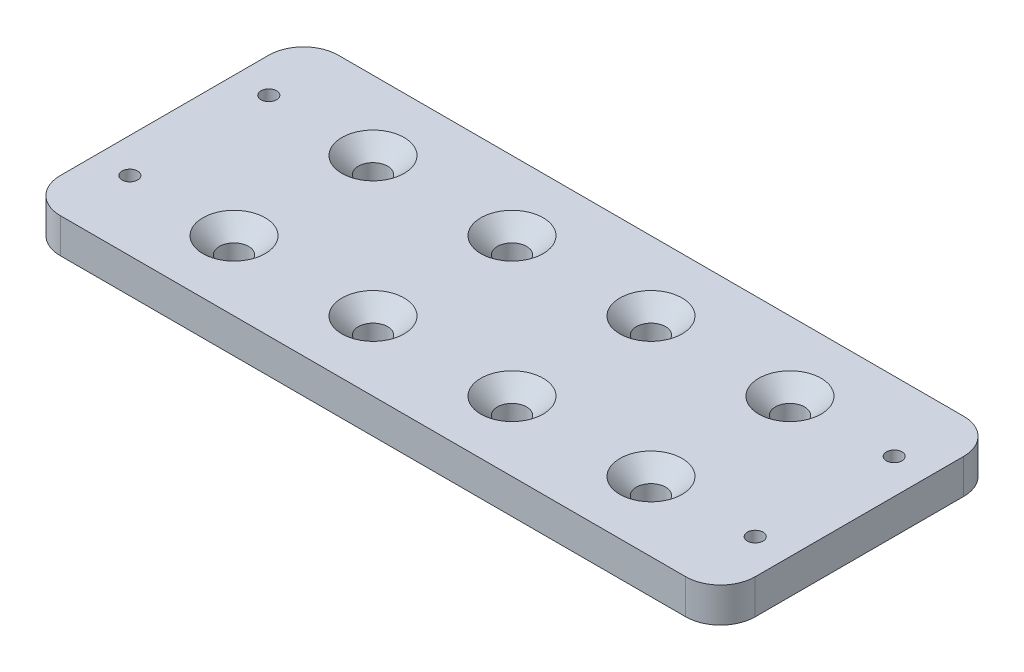
ISO-10303-21;
HEADER;
FILE_DESCRIPTION(('STEP AP214'),'2;1');
FILE_NAME('part.step','',(''),(''),'','','');
FILE_SCHEMA(('AUTOMOTIVE_DESIGN { 1 0 10303 214 1 1 1 1 }'));
ENDSEC;
DATA;
#1=APPLICATION_CONTEXT('core data for automotive mechanical design processes');
#2=APPLICATION_PROTOCOL_DEFINITION('international standard','automotive_design',2000,#1);
#3=PRODUCT_CONTEXT('',#1,'mechanical');
#4=PRODUCT('Part','Part','',(#3));
#5=PRODUCT_RELATED_PRODUCT_CATEGORY('part','',(#4));
#6=PRODUCT_DEFINITION_FORMATION('','',#4);
#7=PRODUCT_DEFINITION_CONTEXT('part definition',#1,'design');
#8=PRODUCT_DEFINITION('design','',#6,#7);
#9=PRODUCT_DEFINITION_SHAPE('','',#8);
#10=(LENGTH_UNIT() NAMED_UNIT(*) SI_UNIT(.MILLI.,.METRE.));
#11=(NAMED_UNIT(*) PLANE_ANGLE_UNIT() SI_UNIT($,.RADIAN.));
#12=(NAMED_UNIT(*) SI_UNIT($,.STERADIAN.) SOLID_ANGLE_UNIT());
#13=UNCERTAINTY_MEASURE_WITH_UNIT(LENGTH_MEASURE(1.E-05),#10,'distance_accuracy_value','');
#14=(GEOMETRIC_REPRESENTATION_CONTEXT(3) GLOBAL_UNCERTAINTY_ASSIGNED_CONTEXT((#13)) GLOBAL_UNIT_ASSIGNED_CONTEXT((#10,
#11,#12)) REPRESENTATION_CONTEXT('',''));
#15=CARTESIAN_POINT('',(0.,0.,0.));
#16=DIRECTION('',(0.,0.,1.));
#17=DIRECTION('',(1.,0.,0.));
#18=AXIS2_PLACEMENT_3D('',#15,#16,#17);
#19=CARTESIAN_POINT('',(100.,10.,40.));
#20=DIRECTION('',(-1.,0.,0.));
#21=DIRECTION('',(0.,0.,1.));
#22=AXIS2_PLACEMENT_3D('',#19,#20,#21);
#23=PLANE('',#22);
#24=DIRECTION('',(0.,0.,-1.));
#25=VECTOR('',#24,1.);
#26=CARTESIAN_POINT('',(100.,0.,40.));
#27=LINE('',#26,#25);
#28=CARTESIAN_POINT('',(100.,0.,30.));
#29=VERTEX_POINT('',#28);
#30=CARTESIAN_POINT('',(100.,0.,-30.));
#31=VERTEX_POINT('',#30);
#32=EDGE_CURVE('E132',#29,#31,#27,.T.);
#33=ORIENTED_EDGE('',*,*,#32,.T.);
#34=DIRECTION('',(0.,-1.,0.));
#35=VECTOR('',#34,1.);
#36=CARTESIAN_POINT('',(100.,10.,-30.));
#37=LINE('',#36,#35);
#38=CARTESIAN_POINT('',(100.,10.,-30.));
#39=VERTEX_POINT('',#38);
#40=EDGE_CURVE('E11',#31,#39,#37,.F.);
#41=ORIENTED_EDGE('',*,*,#40,.T.);
#42=DIRECTION('',(0.,0.,-1.));
#43=VECTOR('',#42,1.);
#44=CARTESIAN_POINT('',(100.,10.,40.));
#45=LINE('',#44,#43);
#46=CARTESIAN_POINT('',(100.,10.,30.));
#47=VERTEX_POINT('',#46);
#48=EDGE_CURVE('E135',#47,#39,#45,.T.);
#49=ORIENTED_EDGE('',*,*,#48,.F.);
#50=DIRECTION('',(0.,-1.,0.));
#51=VECTOR('',#50,1.);
#52=CARTESIAN_POINT('',(100.,10.,30.));
#53=LINE('',#52,#51);
#54=EDGE_CURVE('E50',#47,#29,#53,.T.);
#55=ORIENTED_EDGE('',*,*,#54,.T.);
#56=EDGE_LOOP('',(#33,#41,#49,#55));
#57=FACE_BOUND('',#56,.T.);
#58=ADVANCED_FACE('F39',(#57),#23,.F.);
#59=CARTESIAN_POINT('',(-100.,10.,-40.));
#60=DIRECTION('',(0.,0.,1.));
#61=DIRECTION('',(1.,0.,0.));
#62=AXIS2_PLACEMENT_3D('',#59,#60,#61);
#63=PLANE('',#62);
#64=DIRECTION('',(-1.,0.,0.));
#65=VECTOR('',#64,1.);
#66=CARTESIAN_POINT('',(-100.,0.,-40.));
#67=LINE('',#66,#65);
#68=CARTESIAN_POINT('',(90.,0.,-40.));
#69=VERTEX_POINT('',#68);
#70=CARTESIAN_POINT('',(-90.,0.,-40.));
#71=VERTEX_POINT('',#70);
#72=EDGE_CURVE('E134',#69,#71,#67,.T.);
#73=ORIENTED_EDGE('',*,*,#72,.T.);
#74=DIRECTION('',(0.,-1.,0.));
#75=VECTOR('',#74,1.);
#76=CARTESIAN_POINT('',(-90.,10.,-40.));
#77=LINE('',#76,#75);
#78=CARTESIAN_POINT('',(-90.,10.,-40.));
#79=VERTEX_POINT('',#78);
#80=EDGE_CURVE('E109',#71,#79,#77,.F.);
#81=ORIENTED_EDGE('',*,*,#80,.T.);
#82=DIRECTION('',(-1.,0.,0.));
#83=VECTOR('',#82,1.);
#84=CARTESIAN_POINT('',(-100.,10.,-40.));
#85=LINE('',#84,#83);
#86=CARTESIAN_POINT('',(90.,10.,-40.));
#87=VERTEX_POINT('',#86);
#88=EDGE_CURVE('E172',#87,#79,#85,.T.);
#89=ORIENTED_EDGE('',*,*,#88,.F.);
#90=DIRECTION('',(0.,-1.,0.));
#91=VECTOR('',#90,1.);
#92=CARTESIAN_POINT('',(90.,10.,-40.));
#93=LINE('',#92,#91);
#94=EDGE_CURVE('E113',#87,#69,#93,.T.);
#95=ORIENTED_EDGE('',*,*,#94,.T.);
#96=EDGE_LOOP('',(#73,#81,#89,#95));
#97=FACE_BOUND('',#96,.T.);
#98=ADVANCED_FACE('F305',(#97),#63,.F.);
#99=CARTESIAN_POINT('',(-100.,10.,40.));
#100=DIRECTION('',(1.,0.,0.));
#101=DIRECTION('',(0.,0.,-1.));
#102=AXIS2_PLACEMENT_3D('',#99,#100,#101);
#103=PLANE('',#102);
#104=DIRECTION('',(0.,0.,1.));
#105=VECTOR('',#104,1.);
#106=CARTESIAN_POINT('',(-100.,10.,40.));
#107=LINE('',#106,#105);
#108=CARTESIAN_POINT('',(-100.,10.,-30.));
#109=VERTEX_POINT('',#108);
#110=CARTESIAN_POINT('',(-100.,10.,30.));
#111=VERTEX_POINT('',#110);
#112=EDGE_CURVE('E125',#109,#111,#107,.T.);
#113=ORIENTED_EDGE('',*,*,#112,.F.);
#114=DIRECTION('',(0.,-1.,0.));
#115=VECTOR('',#114,1.);
#116=CARTESIAN_POINT('',(-100.,10.,-30.));
#117=LINE('',#116,#115);
#118=CARTESIAN_POINT('',(-100.,0.,-30.));
#119=VERTEX_POINT('',#118);
#120=EDGE_CURVE('E108',#109,#119,#117,.T.);
#121=ORIENTED_EDGE('',*,*,#120,.T.);
#122=DIRECTION('',(0.,0.,1.));
#123=VECTOR('',#122,1.);
#124=CARTESIAN_POINT('',(-100.,0.,40.));
#125=LINE('',#124,#123);
#126=CARTESIAN_POINT('',(-100.,0.,30.));
#127=VERTEX_POINT('',#126);
#128=EDGE_CURVE('E124',#119,#127,#125,.T.);
#129=ORIENTED_EDGE('',*,*,#128,.T.);
#130=DIRECTION('',(0.,-1.,0.));
#131=VECTOR('',#130,1.);
#132=CARTESIAN_POINT('',(-100.,10.,30.));
#133=LINE('',#132,#131);
#134=EDGE_CURVE('E127',#127,#111,#133,.F.);
#135=ORIENTED_EDGE('',*,*,#134,.T.);
#136=EDGE_LOOP('',(#113,#121,#129,#135));
#137=FACE_BOUND('',#136,.T.);
#138=ADVANCED_FACE('F123',(#137),#103,.F.);
#139=CARTESIAN_POINT('',(-100.,10.,40.));
#140=DIRECTION('',(0.,0.,-1.));
#141=DIRECTION('',(-1.,0.,0.));
#142=AXIS2_PLACEMENT_3D('',#139,#140,#141);
#143=PLANE('',#142);
#144=DIRECTION('',(1.,0.,0.));
#145=VECTOR('',#144,1.);
#146=CARTESIAN_POINT('',(-100.,10.,40.));
#147=LINE('',#146,#145);
#148=CARTESIAN_POINT('',(-90.,10.,40.));
#149=VERTEX_POINT('',#148);
#150=CARTESIAN_POINT('',(90.,10.,40.));
#151=VERTEX_POINT('',#150);
#152=EDGE_CURVE('E140',#149,#151,#147,.T.);
#153=ORIENTED_EDGE('',*,*,#152,.F.);
#154=DIRECTION('',(0.,-1.,0.));
#155=VECTOR('',#154,1.);
#156=CARTESIAN_POINT('',(-90.,10.,40.));
#157=LINE('',#156,#155);
#158=CARTESIAN_POINT('',(-90.,0.,40.));
#159=VERTEX_POINT('',#158);
#160=EDGE_CURVE('E156',#149,#159,#157,.T.);
#161=ORIENTED_EDGE('',*,*,#160,.T.);
#162=DIRECTION('',(1.,0.,0.));
#163=VECTOR('',#162,1.);
#164=CARTESIAN_POINT('',(-100.,0.,40.));
#165=LINE('',#164,#163);
#166=CARTESIAN_POINT('',(90.,0.,40.));
#167=VERTEX_POINT('',#166);
#168=EDGE_CURVE('E128',#159,#167,#165,.T.);
#169=ORIENTED_EDGE('',*,*,#168,.T.);
#170=DIRECTION('',(0.,-1.,0.));
#171=VECTOR('',#170,1.);
#172=CARTESIAN_POINT('',(90.,10.,40.));
#173=LINE('',#172,#171);
#174=EDGE_CURVE('E53',#167,#151,#173,.F.);
#175=ORIENTED_EDGE('',*,*,#174,.T.);
#176=EDGE_LOOP('',(#153,#161,#169,#175));
#177=FACE_BOUND('',#176,.T.);
#178=ADVANCED_FACE('F280',(#177),#143,.F.);
#179=CARTESIAN_POINT('',(0.,10.,0.));
#180=DIRECTION('',(0.,-1.,0.));
#181=DIRECTION('',(0.,0.,-1.));
#182=AXIS2_PLACEMENT_3D('',#179,#180,#181);
#183=PLANE('',#182);
#184=CARTESIAN_POINT('',(-90.,10.,-20.));
#185=DIRECTION('',(0.,1.,0.));
#186=DIRECTION('',(0.,0.,1.));
#187=AXIS2_PLACEMENT_3D('',#184,#185,#186);
#188=CIRCLE('',#187,2.25);
#189=CARTESIAN_POINT('',(-90.,10.,-17.75));
#190=VERTEX_POINT('',#189);
#191=EDGE_CURVE('E268',#190,#190,#188,.T.);
#192=ORIENTED_EDGE('',*,*,#191,.F.);
#193=EDGE_LOOP('',(#192));
#194=FACE_BOUND('',#193,.T.);
#195=CARTESIAN_POINT('',(90.,10.,-20.));
#196=DIRECTION('',(0.,1.,0.));
#197=DIRECTION('',(0.,0.,1.));
#198=AXIS2_PLACEMENT_3D('',#195,#196,#197);
#199=CIRCLE('',#198,2.25);
#200=CARTESIAN_POINT('',(90.,10.,-17.75));
#201=VERTEX_POINT('',#200);
#202=EDGE_CURVE('E265',#201,#201,#199,.T.);
#203=ORIENTED_EDGE('',*,*,#202,.F.);
#204=EDGE_LOOP('',(#203));
#205=FACE_BOUND('',#204,.T.);
#206=CARTESIAN_POINT('',(90.000000000001,10.,20.));
#207=DIRECTION('',(0.,1.,0.));
#208=DIRECTION('',(0.,0.,1.));
#209=AXIS2_PLACEMENT_3D('',#206,#207,#208);
#210=CIRCLE('',#209,2.25);
#211=CARTESIAN_POINT('',(90.000000000001,10.,22.25));
#212=VERTEX_POINT('',#211);
#213=EDGE_CURVE('E258',#212,#212,#210,.T.);
#214=ORIENTED_EDGE('',*,*,#213,.F.);
#215=EDGE_LOOP('',(#214));
#216=FACE_BOUND('',#215,.T.);
#217=CARTESIAN_POINT('',(-89.9999999999996,10.,20.));
#218=DIRECTION('',(0.,1.,0.));
#219=DIRECTION('',(0.,0.,1.));
#220=AXIS2_PLACEMENT_3D('',#217,#218,#219);
#221=CIRCLE('',#220,2.25);
#222=CARTESIAN_POINT('',(-89.9999999999996,10.,22.25));
#223=VERTEX_POINT('',#222);
#224=EDGE_CURVE('E246',#223,#223,#221,.T.);
#225=ORIENTED_EDGE('',*,*,#224,.F.);
#226=EDGE_LOOP('',(#225));
#227=FACE_BOUND('',#226,.T.);
#228=CARTESIAN_POINT('',(-20.,10.,-20.));
#229=DIRECTION('',(0.,1.,0.));
#230=DIRECTION('',(0.,0.,1.));
#231=AXIS2_PLACEMENT_3D('',#228,#229,#230);
#232=CIRCLE('',#231,8.96);
#233=CARTESIAN_POINT('',(-20.,10.,-11.04));
#234=VERTEX_POINT('',#233);
#235=EDGE_CURVE('E243',#234,#234,#232,.T.);
#236=ORIENTED_EDGE('',*,*,#235,.F.);
#237=EDGE_LOOP('',(#236));
#238=FACE_BOUND('',#237,.T.);
#239=CARTESIAN_POINT('',(19.9999999999995,10.,20.));
#240=DIRECTION('',(0.,1.,0.));
#241=DIRECTION('',(0.,0.,1.));
#242=AXIS2_PLACEMENT_3D('',#239,#240,#241);
#243=CIRCLE('',#242,8.96);
#244=CARTESIAN_POINT('',(19.9999999999995,10.,28.96));
#245=VERTEX_POINT('',#244);
#246=EDGE_CURVE('E231',#245,#245,#243,.T.);
#247=ORIENTED_EDGE('',*,*,#246,.F.);
#248=EDGE_LOOP('',(#247));
#249=FACE_BOUND('',#248,.T.);
#250=CARTESIAN_POINT('',(59.9999999999996,10.,20.));
#251=DIRECTION('',(0.,1.,0.));
#252=DIRECTION('',(0.,0.,1.));
#253=AXIS2_PLACEMENT_3D('',#250,#251,#252);
#254=CIRCLE('',#253,8.96);
#255=CARTESIAN_POINT('',(59.9999999999996,10.,28.96));
#256=VERTEX_POINT('',#255);
#257=EDGE_CURVE('E229',#256,#256,#254,.T.);
#258=ORIENTED_EDGE('',*,*,#257,.F.);
#259=EDGE_LOOP('',(#258));
#260=FACE_BOUND('',#259,.T.);
#261=CARTESIAN_POINT('',(-19.9999999999996,10.,20.));
#262=DIRECTION('',(0.,1.,0.));
#263=DIRECTION('',(0.,0.,1.));
#264=AXIS2_PLACEMENT_3D('',#261,#262,#263);
#265=CIRCLE('',#264,8.96);
#266=CARTESIAN_POINT('',(-19.9999999999996,10.,28.96));
#267=VERTEX_POINT('',#266);
#268=EDGE_CURVE('E220',#267,#267,#265,.T.);
#269=ORIENTED_EDGE('',*,*,#268,.F.);
#270=EDGE_LOOP('',(#269));
#271=FACE_BOUND('',#270,.T.);
#272=CARTESIAN_POINT('',(-59.9999999999996,10.,20.));
#273=DIRECTION('',(0.,1.,0.));
#274=DIRECTION('',(0.,0.,1.));
#275=AXIS2_PLACEMENT_3D('',#272,#273,#274);
#276=CIRCLE('',#275,8.96);
#277=CARTESIAN_POINT('',(-59.9999999999996,10.,28.96));
#278=VERTEX_POINT('',#277);
#279=EDGE_CURVE('E208',#278,#278,#276,.T.);
#280=ORIENTED_EDGE('',*,*,#279,.F.);
#281=EDGE_LOOP('',(#280));
#282=FACE_BOUND('',#281,.T.);
#283=CARTESIAN_POINT('',(59.9999999999999,10.,-20.));
#284=DIRECTION('',(0.,1.,0.));
#285=DIRECTION('',(0.,0.,1.));
#286=AXIS2_PLACEMENT_3D('',#283,#284,#285);
#287=CIRCLE('',#286,8.96);
#288=CARTESIAN_POINT('',(59.9999999999999,10.,-11.04));
#289=VERTEX_POINT('',#288);
#290=EDGE_CURVE('E200',#289,#289,#287,.T.);
#291=ORIENTED_EDGE('',*,*,#290,.F.);
#292=EDGE_LOOP('',(#291));
#293=FACE_BOUND('',#292,.T.);
#294=CARTESIAN_POINT('',(19.9999999999999,10.,-20.));
#295=DIRECTION('',(0.,1.,0.));
#296=DIRECTION('',(0.,0.,1.));
#297=AXIS2_PLACEMENT_3D('',#294,#295,#296);
#298=CIRCLE('',#297,8.96);
#299=CARTESIAN_POINT('',(19.9999999999999,10.,-11.04));
#300=VERTEX_POINT('',#299);
#301=EDGE_CURVE('E187',#300,#300,#298,.T.);
#302=ORIENTED_EDGE('',*,*,#301,.F.);
#303=EDGE_LOOP('',(#302));
#304=FACE_BOUND('',#303,.T.);
#305=CARTESIAN_POINT('',(-60.,10.,-20.));
#306=DIRECTION('',(0.,1.,0.));
#307=DIRECTION('',(0.,0.,1.));
#308=AXIS2_PLACEMENT_3D('',#305,#306,#307);
#309=CIRCLE('',#308,8.96);
#310=CARTESIAN_POINT('',(-60.,10.,-11.04));
#311=VERTEX_POINT('',#310);
#312=EDGE_CURVE('E182',#311,#311,#309,.T.);
#313=ORIENTED_EDGE('',*,*,#312,.F.);
#314=EDGE_LOOP('',(#313));
#315=FACE_BOUND('',#314,.T.);
#316=ORIENTED_EDGE('',*,*,#88,.T.);
#317=CARTESIAN_POINT('',(-90.,10.,-30.));
#318=DIRECTION('',(0.,-1.,0.));
#319=DIRECTION('',(0.,0.,-1.));
#320=AXIS2_PLACEMENT_3D('',#317,#318,#319);
#321=CIRCLE('',#320,10.);
#322=EDGE_CURVE('E153',#79,#109,#321,.F.);
#323=ORIENTED_EDGE('',*,*,#322,.T.);
#324=ORIENTED_EDGE('',*,*,#112,.T.);
#325=CARTESIAN_POINT('',(-90.,10.,30.));
#326=DIRECTION('',(0.,-1.,0.));
#327=DIRECTION('',(0.,0.,-1.));
#328=AXIS2_PLACEMENT_3D('',#325,#326,#327);
#329=CIRCLE('',#328,10.);
#330=EDGE_CURVE('E64',#111,#149,#329,.F.);
#331=ORIENTED_EDGE('',*,*,#330,.T.);
#332=ORIENTED_EDGE('',*,*,#152,.T.);
#333=CARTESIAN_POINT('',(90.,10.,30.));
#334=DIRECTION('',(0.,-1.,0.));
#335=DIRECTION('',(0.,0.,-1.));
#336=AXIS2_PLACEMENT_3D('',#333,#334,#335);
#337=CIRCLE('',#336,10.);
#338=EDGE_CURVE('E146',#151,#47,#337,.F.);
#339=ORIENTED_EDGE('',*,*,#338,.T.);
#340=ORIENTED_EDGE('',*,*,#48,.T.);
#341=CARTESIAN_POINT('',(90.,10.,-30.));
#342=DIRECTION('',(0.,-1.,0.));
#343=DIRECTION('',(0.,0.,-1.));
#344=AXIS2_PLACEMENT_3D('',#341,#342,#343);
#345=CIRCLE('',#344,10.);
#346=EDGE_CURVE('E147',#39,#87,#345,.F.);
#347=ORIENTED_EDGE('',*,*,#346,.T.);
#348=EDGE_LOOP('',(#316,#323,#324,#331,#332,#339,#340,#347));
#349=FACE_BOUND('',#348,.T.);
#350=ADVANCED_FACE('F273',(#194,#205,#216,#227,#238,#249,#260,#271,#282,#293,#304,#315,#349),
#183,.F.);
#351=CARTESIAN_POINT('',(0.,0.,0.));
#352=DIRECTION('',(0.,-1.,0.));
#353=DIRECTION('',(0.,0.,-1.));
#354=AXIS2_PLACEMENT_3D('',#351,#352,#353);
#355=PLANE('',#354);
#356=CARTESIAN_POINT('',(-90.,0.,-20.));
#357=DIRECTION('',(0.,1.,0.));
#358=DIRECTION('',(0.,0.,1.));
#359=AXIS2_PLACEMENT_3D('',#356,#357,#358);
#360=CIRCLE('',#359,2.25);
#361=CARTESIAN_POINT('',(-90.,0.,-17.75));
#362=VERTEX_POINT('',#361);
#363=EDGE_CURVE('E264',#362,#362,#360,.T.);
#364=ORIENTED_EDGE('',*,*,#363,.T.);
#365=EDGE_LOOP('',(#364));
#366=FACE_BOUND('',#365,.T.);
#367=CARTESIAN_POINT('',(90.,0.,-20.));
#368=DIRECTION('',(0.,1.,0.));
#369=DIRECTION('',(0.,0.,1.));
#370=AXIS2_PLACEMENT_3D('',#367,#368,#369);
#371=CIRCLE('',#370,2.25);
#372=CARTESIAN_POINT('',(90.,0.,-17.75));
#373=VERTEX_POINT('',#372);
#374=EDGE_CURVE('E259',#373,#373,#371,.T.);
#375=ORIENTED_EDGE('',*,*,#374,.T.);
#376=EDGE_LOOP('',(#375));
#377=FACE_BOUND('',#376,.T.);
#378=CARTESIAN_POINT('',(90.000000000001,0.,20.));
#379=DIRECTION('',(0.,1.,0.));
#380=DIRECTION('',(0.,0.,1.));
#381=AXIS2_PLACEMENT_3D('',#378,#379,#380);
#382=CIRCLE('',#381,2.25);
#383=CARTESIAN_POINT('',(90.000000000001,0.,22.25));
#384=VERTEX_POINT('',#383);
#385=EDGE_CURVE('E251',#384,#384,#382,.T.);
#386=ORIENTED_EDGE('',*,*,#385,.T.);
#387=EDGE_LOOP('',(#386));
#388=FACE_BOUND('',#387,.T.);
#389=CARTESIAN_POINT('',(-89.9999999999996,0.,20.));
#390=DIRECTION('',(0.,1.,0.));
#391=DIRECTION('',(0.,0.,1.));
#392=AXIS2_PLACEMENT_3D('',#389,#390,#391);
#393=CIRCLE('',#392,2.25);
#394=CARTESIAN_POINT('',(-89.9999999999996,0.,22.25));
#395=VERTEX_POINT('',#394);
#396=EDGE_CURVE('E249',#395,#395,#393,.T.);
#397=ORIENTED_EDGE('',*,*,#396,.T.);
#398=EDGE_LOOP('',(#397));
#399=FACE_BOUND('',#398,.T.);
#400=CARTESIAN_POINT('',(-20.,0.,-20.));
#401=DIRECTION('',(0.,1.,0.));
#402=DIRECTION('',(0.,0.,1.));
#403=AXIS2_PLACEMENT_3D('',#400,#401,#402);
#404=CIRCLE('',#403,4.2);
#405=CARTESIAN_POINT('',(-20.,0.,-15.8));
#406=VERTEX_POINT('',#405);
#407=EDGE_CURVE('E236',#406,#406,#404,.T.);
#408=ORIENTED_EDGE('',*,*,#407,.T.);
#409=EDGE_LOOP('',(#408));
#410=FACE_BOUND('',#409,.T.);
#411=CARTESIAN_POINT('',(19.9999999999995,0.,20.));
#412=DIRECTION('',(0.,1.,0.));
#413=DIRECTION('',(0.,0.,1.));
#414=AXIS2_PLACEMENT_3D('',#411,#412,#413);
#415=CIRCLE('',#414,4.2);
#416=CARTESIAN_POINT('',(19.9999999999995,0.,24.2));
#417=VERTEX_POINT('',#416);
#418=EDGE_CURVE('E228',#417,#417,#415,.T.);
#419=ORIENTED_EDGE('',*,*,#418,.T.);
#420=EDGE_LOOP('',(#419));
#421=FACE_BOUND('',#420,.T.);
#422=CARTESIAN_POINT('',(59.9999999999996,0.,20.));
#423=DIRECTION('',(0.,1.,0.));
#424=DIRECTION('',(0.,0.,1.));
#425=AXIS2_PLACEMENT_3D('',#422,#423,#424);
#426=CIRCLE('',#425,4.2);
#427=CARTESIAN_POINT('',(59.9999999999996,0.,24.2));
#428=VERTEX_POINT('',#427);
#429=EDGE_CURVE('E219',#428,#428,#426,.T.);
#430=ORIENTED_EDGE('',*,*,#429,.T.);
#431=EDGE_LOOP('',(#430));
#432=FACE_BOUND('',#431,.T.);
#433=CARTESIAN_POINT('',(-19.9999999999996,0.,20.));
#434=DIRECTION('',(0.,1.,0.));
#435=DIRECTION('',(0.,0.,1.));
#436=AXIS2_PLACEMENT_3D('',#433,#434,#435);
#437=CIRCLE('',#436,4.2);
#438=CARTESIAN_POINT('',(-19.9999999999996,0.,24.2));
#439=VERTEX_POINT('',#438);
#440=EDGE_CURVE('E211',#439,#439,#437,.T.);
#441=ORIENTED_EDGE('',*,*,#440,.T.);
#442=EDGE_LOOP('',(#441));
#443=FACE_BOUND('',#442,.T.);
#444=CARTESIAN_POINT('',(-59.9999999999996,0.,20.));
#445=DIRECTION('',(0.,1.,0.));
#446=DIRECTION('',(0.,0.,1.));
#447=AXIS2_PLACEMENT_3D('',#444,#445,#446);
#448=CIRCLE('',#447,4.2);
#449=CARTESIAN_POINT('',(-59.9999999999996,0.,24.2));
#450=VERTEX_POINT('',#449);
#451=EDGE_CURVE('E205',#450,#450,#448,.T.);
#452=ORIENTED_EDGE('',*,*,#451,.T.);
#453=EDGE_LOOP('',(#452));
#454=FACE_BOUND('',#453,.T.);
#455=CARTESIAN_POINT('',(59.9999999999999,0.,-20.));
#456=DIRECTION('',(0.,1.,0.));
#457=DIRECTION('',(0.,0.,1.));
#458=AXIS2_PLACEMENT_3D('',#455,#456,#457);
#459=CIRCLE('',#458,4.2);
#460=CARTESIAN_POINT('',(59.9999999999999,0.,-15.8));
#461=VERTEX_POINT('',#460);
#462=EDGE_CURVE('E192',#461,#461,#459,.T.);
#463=ORIENTED_EDGE('',*,*,#462,.T.);
#464=EDGE_LOOP('',(#463));
#465=FACE_BOUND('',#464,.T.);
#466=CARTESIAN_POINT('',(19.9999999999999,0.,-20.));
#467=DIRECTION('',(0.,1.,0.));
#468=DIRECTION('',(0.,0.,1.));
#469=AXIS2_PLACEMENT_3D('',#466,#467,#468);
#470=CIRCLE('',#469,4.2);
#471=CARTESIAN_POINT('',(19.9999999999999,0.,-15.8));
#472=VERTEX_POINT('',#471);
#473=EDGE_CURVE('E184',#472,#472,#470,.T.);
#474=ORIENTED_EDGE('',*,*,#473,.T.);
#475=EDGE_LOOP('',(#474));
#476=FACE_BOUND('',#475,.T.);
#477=CARTESIAN_POINT('',(-60.,0.,-20.));
#478=DIRECTION('',(0.,1.,0.));
#479=DIRECTION('',(0.,0.,1.));
#480=AXIS2_PLACEMENT_3D('',#477,#478,#479);
#481=CIRCLE('',#480,4.2);
#482=CARTESIAN_POINT('',(-60.,0.,-15.8));
#483=VERTEX_POINT('',#482);
#484=EDGE_CURVE('E169',#483,#483,#481,.T.);
#485=ORIENTED_EDGE('',*,*,#484,.T.);
#486=EDGE_LOOP('',(#485));
#487=FACE_BOUND('',#486,.T.);
#488=ORIENTED_EDGE('',*,*,#128,.F.);
#489=CARTESIAN_POINT('',(-90.,0.,-30.));
#490=DIRECTION('',(0.,-1.,0.));
#491=DIRECTION('',(0.,0.,-1.));
#492=AXIS2_PLACEMENT_3D('',#489,#490,#491);
#493=CIRCLE('',#492,10.);
#494=EDGE_CURVE('E104',#119,#71,#493,.T.);
#495=ORIENTED_EDGE('',*,*,#494,.T.);
#496=ORIENTED_EDGE('',*,*,#72,.F.);
#497=CARTESIAN_POINT('',(90.,0.,-30.));
#498=DIRECTION('',(0.,-1.,0.));
#499=DIRECTION('',(0.,0.,-1.));
#500=AXIS2_PLACEMENT_3D('',#497,#498,#499);
#501=CIRCLE('',#500,10.);
#502=EDGE_CURVE('E142',#69,#31,#501,.T.);
#503=ORIENTED_EDGE('',*,*,#502,.T.);
#504=ORIENTED_EDGE('',*,*,#32,.F.);
#505=CARTESIAN_POINT('',(90.,0.,30.));
#506=DIRECTION('',(0.,-1.,0.));
#507=DIRECTION('',(0.,0.,-1.));
#508=AXIS2_PLACEMENT_3D('',#505,#506,#507);
#509=CIRCLE('',#508,10.);
#510=EDGE_CURVE('E121',#29,#167,#509,.T.);
#511=ORIENTED_EDGE('',*,*,#510,.T.);
#512=ORIENTED_EDGE('',*,*,#168,.F.);
#513=CARTESIAN_POINT('',(-90.,0.,30.));
#514=DIRECTION('',(0.,-1.,0.));
#515=DIRECTION('',(0.,0.,-1.));
#516=AXIS2_PLACEMENT_3D('',#513,#514,#515);
#517=CIRCLE('',#516,10.);
#518=EDGE_CURVE('E119',#159,#127,#517,.T.);
#519=ORIENTED_EDGE('',*,*,#518,.T.);
#520=EDGE_LOOP('',(#488,#495,#496,#503,#504,#511,#512,#519));
#521=FACE_BOUND('',#520,.T.);
#522=ADVANCED_FACE('F126',(#366,#377,#388,#399,#410,#421,#432,#443,#454,#465,#476,#487,#521),
#355,.T.);
#523=CARTESIAN_POINT('',(-60.,10.,-20.));
#524=DIRECTION('',(0.,1.,0.));
#525=DIRECTION('',(0.,0.,1.));
#526=AXIS2_PLACEMENT_3D('',#523,#524,#525);
#527=CYLINDRICAL_SURFACE('',#526,4.2);
#528=ORIENTED_EDGE('',*,*,#484,.F.);
#529=EDGE_LOOP('',(#528));
#530=FACE_BOUND('',#529,.T.);
#531=CARTESIAN_POINT('',(-60.,5.24,-20.));
#532=DIRECTION('',(0.,1.,0.));
#533=DIRECTION('',(0.,0.,1.));
#534=AXIS2_PLACEMENT_3D('',#531,#532,#533);
#535=CIRCLE('',#534,4.2);
#536=CARTESIAN_POINT('',(-60.,5.24,-15.8));
#537=VERTEX_POINT('',#536);
#538=EDGE_CURVE('E168',#537,#537,#535,.T.);
#539=ORIENTED_EDGE('',*,*,#538,.T.);
#540=EDGE_LOOP('',(#539));
#541=FACE_BOUND('',#540,.T.);
#542=ADVANCED_FACE('F333',(#530,#541),#527,.F.);
#543=CARTESIAN_POINT('',(-60.,10.,-20.));
#544=DIRECTION('',(0.,1.,0.));
#545=DIRECTION('',(0.,0.,1.));
#546=AXIS2_PLACEMENT_3D('',#543,#544,#545);
#547=CONICAL_SURFACE('',#546,8.96,0.785398163397448);
#548=ORIENTED_EDGE('',*,*,#538,.F.);
#549=EDGE_LOOP('',(#548));
#550=FACE_BOUND('',#549,.T.);
#551=ORIENTED_EDGE('',*,*,#312,.T.);
#552=EDGE_LOOP('',(#551));
#553=FACE_BOUND('',#552,.T.);
#554=ADVANCED_FACE('F337',(#550,#553),#547,.F.);
#555=CARTESIAN_POINT('',(19.9999999999999,10.,-20.));
#556=DIRECTION('',(0.,1.,0.));
#557=DIRECTION('',(0.,0.,1.));
#558=AXIS2_PLACEMENT_3D('',#555,#556,#557);
#559=CYLINDRICAL_SURFACE('',#558,4.2);
#560=ORIENTED_EDGE('',*,*,#473,.F.);
#561=EDGE_LOOP('',(#560));
#562=FACE_BOUND('',#561,.T.);
#563=CARTESIAN_POINT('',(19.9999999999999,5.24,-20.));
#564=DIRECTION('',(0.,1.,0.));
#565=DIRECTION('',(0.,0.,1.));
#566=AXIS2_PLACEMENT_3D('',#563,#564,#565);
#567=CIRCLE('',#566,4.2);
#568=CARTESIAN_POINT('',(19.9999999999999,5.24,-15.8));
#569=VERTEX_POINT('',#568);
#570=EDGE_CURVE('E186',#569,#569,#567,.T.);
#571=ORIENTED_EDGE('',*,*,#570,.T.);
#572=EDGE_LOOP('',(#571));
#573=FACE_BOUND('',#572,.T.);
#574=ADVANCED_FACE('F345',(#562,#573),#559,.F.);
#575=CARTESIAN_POINT('',(19.9999999999999,10.,-20.));
#576=DIRECTION('',(0.,1.,0.));
#577=DIRECTION('',(0.,0.,1.));
#578=AXIS2_PLACEMENT_3D('',#575,#576,#577);
#579=CONICAL_SURFACE('',#578,8.96,0.785398163397449);
#580=ORIENTED_EDGE('',*,*,#570,.F.);
#581=EDGE_LOOP('',(#580));
#582=FACE_BOUND('',#581,.T.);
#583=ORIENTED_EDGE('',*,*,#301,.T.);
#584=EDGE_LOOP('',(#583));
#585=FACE_BOUND('',#584,.T.);
#586=ADVANCED_FACE('F346',(#582,#585),#579,.F.);
#587=CARTESIAN_POINT('',(59.9999999999999,10.,-20.));
#588=DIRECTION('',(0.,1.,0.));
#589=DIRECTION('',(0.,0.,1.));
#590=AXIS2_PLACEMENT_3D('',#587,#588,#589);
#591=CYLINDRICAL_SURFACE('',#590,4.2);
#592=ORIENTED_EDGE('',*,*,#462,.F.);
#593=EDGE_LOOP('',(#592));
#594=FACE_BOUND('',#593,.T.);
#595=CARTESIAN_POINT('',(59.9999999999999,5.24,-20.));
#596=DIRECTION('',(0.,1.,0.));
#597=DIRECTION('',(0.,0.,1.));
#598=AXIS2_PLACEMENT_3D('',#595,#596,#597);
#599=CIRCLE('',#598,4.2);
#600=CARTESIAN_POINT('',(59.9999999999999,5.24,-15.8));
#601=VERTEX_POINT('',#600);
#602=EDGE_CURVE('E198',#601,#601,#599,.T.);
#603=ORIENTED_EDGE('',*,*,#602,.T.);
#604=EDGE_LOOP('',(#603));
#605=FACE_BOUND('',#604,.T.);
#606=ADVANCED_FACE('F351',(#594,#605),#591,.F.);
#607=CARTESIAN_POINT('',(59.9999999999999,10.,-20.));
#608=DIRECTION('',(0.,1.,0.));
#609=DIRECTION('',(0.,0.,1.));
#610=AXIS2_PLACEMENT_3D('',#607,#608,#609);
#611=CONICAL_SURFACE('',#610,8.96,0.785398163397448);
#612=ORIENTED_EDGE('',*,*,#602,.F.);
#613=EDGE_LOOP('',(#612));
#614=FACE_BOUND('',#613,.T.);
#615=ORIENTED_EDGE('',*,*,#290,.T.);
#616=EDGE_LOOP('',(#615));
#617=FACE_BOUND('',#616,.T.);
#618=ADVANCED_FACE('F358',(#614,#617),#611,.F.);
#619=CARTESIAN_POINT('',(-59.9999999999996,10.,20.));
#620=DIRECTION('',(0.,1.,0.));
#621=DIRECTION('',(0.,0.,1.));
#622=AXIS2_PLACEMENT_3D('',#619,#620,#621);
#623=CYLINDRICAL_SURFACE('',#622,4.2);
#624=ORIENTED_EDGE('',*,*,#451,.F.);
#625=EDGE_LOOP('',(#624));
#626=FACE_BOUND('',#625,.T.);
#627=CARTESIAN_POINT('',(-59.9999999999996,5.24,20.));
#628=DIRECTION('',(0.,1.,0.));
#629=DIRECTION('',(0.,0.,1.));
#630=AXIS2_PLACEMENT_3D('',#627,#628,#629);
#631=CIRCLE('',#630,4.2);
#632=CARTESIAN_POINT('',(-59.9999999999996,5.24,24.2));
#633=VERTEX_POINT('',#632);
#634=EDGE_CURVE('E202',#633,#633,#631,.T.);
#635=ORIENTED_EDGE('',*,*,#634,.T.);
#636=EDGE_LOOP('',(#635));
#637=FACE_BOUND('',#636,.T.);
#638=ADVANCED_FACE('F356',(#626,#637),#623,.F.);
#639=CARTESIAN_POINT('',(-59.9999999999996,10.,20.));
#640=DIRECTION('',(0.,1.,0.));
#641=DIRECTION('',(0.,0.,1.));
#642=AXIS2_PLACEMENT_3D('',#639,#640,#641);
#643=CONICAL_SURFACE('',#642,8.96,0.785398163397448);
#644=ORIENTED_EDGE('',*,*,#634,.F.);
#645=EDGE_LOOP('',(#644));
#646=FACE_BOUND('',#645,.T.);
#647=ORIENTED_EDGE('',*,*,#279,.T.);
#648=EDGE_LOOP('',(#647));
#649=FACE_BOUND('',#648,.T.);
#650=ADVANCED_FACE('F365',(#646,#649),#643,.F.);
#651=CARTESIAN_POINT('',(-19.9999999999996,10.,20.));
#652=DIRECTION('',(0.,1.,0.));
#653=DIRECTION('',(0.,0.,1.));
#654=AXIS2_PLACEMENT_3D('',#651,#652,#653);
#655=CYLINDRICAL_SURFACE('',#654,4.2);
#656=ORIENTED_EDGE('',*,*,#440,.F.);
#657=EDGE_LOOP('',(#656));
#658=FACE_BOUND('',#657,.T.);
#659=CARTESIAN_POINT('',(-19.9999999999996,5.24,20.));
#660=DIRECTION('',(0.,1.,0.));
#661=DIRECTION('',(0.,0.,1.));
#662=AXIS2_PLACEMENT_3D('',#659,#660,#661);
#663=CIRCLE('',#662,4.2);
#664=CARTESIAN_POINT('',(-19.9999999999996,5.24,24.2));
#665=VERTEX_POINT('',#664);
#666=EDGE_CURVE('E212',#665,#665,#663,.T.);
#667=ORIENTED_EDGE('',*,*,#666,.T.);
#668=EDGE_LOOP('',(#667));
#669=FACE_BOUND('',#668,.T.);
#670=ADVANCED_FACE('F366',(#658,#669),#655,.F.);
#671=CARTESIAN_POINT('',(-19.9999999999996,10.,20.));
#672=DIRECTION('',(0.,1.,0.));
#673=DIRECTION('',(0.,0.,1.));
#674=AXIS2_PLACEMENT_3D('',#671,#672,#673);
#675=CONICAL_SURFACE('',#674,8.96,0.785398163397449);
#676=ORIENTED_EDGE('',*,*,#666,.F.);
#677=EDGE_LOOP('',(#676));
#678=FACE_BOUND('',#677,.T.);
#679=ORIENTED_EDGE('',*,*,#268,.T.);
#680=EDGE_LOOP('',(#679));
#681=FACE_BOUND('',#680,.T.);
#682=ADVANCED_FACE('F375',(#678,#681),#675,.F.);
#683=CARTESIAN_POINT('',(59.9999999999996,10.,20.));
#684=DIRECTION('',(0.,1.,0.));
#685=DIRECTION('',(0.,0.,1.));
#686=AXIS2_PLACEMENT_3D('',#683,#684,#685);
#687=CYLINDRICAL_SURFACE('',#686,4.2);
#688=ORIENTED_EDGE('',*,*,#429,.F.);
#689=EDGE_LOOP('',(#688));
#690=FACE_BOUND('',#689,.T.);
#691=CARTESIAN_POINT('',(59.9999999999996,5.24,20.));
#692=DIRECTION('',(0.,1.,0.));
#693=DIRECTION('',(0.,0.,1.));
#694=AXIS2_PLACEMENT_3D('',#691,#692,#693);
#695=CIRCLE('',#694,4.2);
#696=CARTESIAN_POINT('',(59.9999999999996,5.24,24.2));
#697=VERTEX_POINT('',#696);
#698=EDGE_CURVE('E224',#697,#697,#695,.T.);
#699=ORIENTED_EDGE('',*,*,#698,.T.);
#700=EDGE_LOOP('',(#699));
#701=FACE_BOUND('',#700,.T.);
#702=ADVANCED_FACE('F376',(#690,#701),#687,.F.);
#703=CARTESIAN_POINT('',(59.9999999999996,10.,20.));
#704=DIRECTION('',(0.,1.,0.));
#705=DIRECTION('',(0.,0.,1.));
#706=AXIS2_PLACEMENT_3D('',#703,#704,#705);
#707=CONICAL_SURFACE('',#706,8.96,0.785398163397448);
#708=ORIENTED_EDGE('',*,*,#698,.F.);
#709=EDGE_LOOP('',(#708));
#710=FACE_BOUND('',#709,.T.);
#711=ORIENTED_EDGE('',*,*,#257,.T.);
#712=EDGE_LOOP('',(#711));
#713=FACE_BOUND('',#712,.T.);
#714=ADVANCED_FACE('F379',(#710,#713),#707,.F.);
#715=CARTESIAN_POINT('',(19.9999999999995,10.,20.));
#716=DIRECTION('',(0.,1.,0.));
#717=DIRECTION('',(0.,0.,1.));
#718=AXIS2_PLACEMENT_3D('',#715,#716,#717);
#719=CYLINDRICAL_SURFACE('',#718,4.2);
#720=ORIENTED_EDGE('',*,*,#418,.F.);
#721=EDGE_LOOP('',(#720));
#722=FACE_BOUND('',#721,.T.);
#723=CARTESIAN_POINT('',(19.9999999999995,5.24,20.));
#724=DIRECTION('',(0.,1.,0.));
#725=DIRECTION('',(0.,0.,1.));
#726=AXIS2_PLACEMENT_3D('',#723,#724,#725);
#727=CIRCLE('',#726,4.2);
#728=CARTESIAN_POINT('',(19.9999999999995,5.24,24.2));
#729=VERTEX_POINT('',#728);
#730=EDGE_CURVE('E234',#729,#729,#727,.T.);
#731=ORIENTED_EDGE('',*,*,#730,.T.);
#732=EDGE_LOOP('',(#731));
#733=FACE_BOUND('',#732,.T.);
#734=ADVANCED_FACE('F383',(#722,#733),#719,.F.);
#735=CARTESIAN_POINT('',(19.9999999999995,10.,20.));
#736=DIRECTION('',(0.,1.,0.));
#737=DIRECTION('',(0.,0.,1.));
#738=AXIS2_PLACEMENT_3D('',#735,#736,#737);
#739=CONICAL_SURFACE('',#738,8.96,0.785398163397449);
#740=ORIENTED_EDGE('',*,*,#730,.F.);
#741=EDGE_LOOP('',(#740));
#742=FACE_BOUND('',#741,.T.);
#743=ORIENTED_EDGE('',*,*,#246,.T.);
#744=EDGE_LOOP('',(#743));
#745=FACE_BOUND('',#744,.T.);
#746=ADVANCED_FACE('F389',(#742,#745),#739,.F.);
#747=CARTESIAN_POINT('',(-20.,10.,-20.));
#748=DIRECTION('',(0.,1.,0.));
#749=DIRECTION('',(0.,0.,1.));
#750=AXIS2_PLACEMENT_3D('',#747,#748,#749);
#751=CYLINDRICAL_SURFACE('',#750,4.2);
#752=ORIENTED_EDGE('',*,*,#407,.F.);
#753=EDGE_LOOP('',(#752));
#754=FACE_BOUND('',#753,.T.);
#755=CARTESIAN_POINT('',(-20.,5.24,-20.));
#756=DIRECTION('',(0.,1.,0.));
#757=DIRECTION('',(0.,0.,1.));
#758=AXIS2_PLACEMENT_3D('',#755,#756,#757);
#759=CIRCLE('',#758,4.2);
#760=CARTESIAN_POINT('',(-20.,5.24,-15.8));
#761=VERTEX_POINT('',#760);
#762=EDGE_CURVE('E244',#761,#761,#759,.T.);
#763=ORIENTED_EDGE('',*,*,#762,.T.);
#764=EDGE_LOOP('',(#763));
#765=FACE_BOUND('',#764,.T.);
#766=ADVANCED_FACE('F391',(#754,#765),#751,.F.);
#767=CARTESIAN_POINT('',(-20.,10.,-20.));
#768=DIRECTION('',(0.,1.,0.));
#769=DIRECTION('',(0.,0.,1.));
#770=AXIS2_PLACEMENT_3D('',#767,#768,#769);
#771=CONICAL_SURFACE('',#770,8.96,0.785398163397449);
#772=ORIENTED_EDGE('',*,*,#762,.F.);
#773=EDGE_LOOP('',(#772));
#774=FACE_BOUND('',#773,.T.);
#775=ORIENTED_EDGE('',*,*,#235,.T.);
#776=EDGE_LOOP('',(#775));
#777=FACE_BOUND('',#776,.T.);
#778=ADVANCED_FACE('F398',(#774,#777),#771,.F.);
#779=CARTESIAN_POINT('',(-89.9999999999996,10.,20.));
#780=DIRECTION('',(0.,1.,0.));
#781=DIRECTION('',(0.,0.,1.));
#782=AXIS2_PLACEMENT_3D('',#779,#780,#781);
#783=CYLINDRICAL_SURFACE('',#782,2.25);
#784=ORIENTED_EDGE('',*,*,#396,.F.);
#785=EDGE_LOOP('',(#784));
#786=FACE_BOUND('',#785,.T.);
#787=ORIENTED_EDGE('',*,*,#224,.T.);
#788=EDGE_LOOP('',(#787));
#789=FACE_BOUND('',#788,.T.);
#790=ADVANCED_FACE('F396',(#786,#789),#783,.F.);
#791=CARTESIAN_POINT('',(90.000000000001,10.,20.));
#792=DIRECTION('',(0.,1.,0.));
#793=DIRECTION('',(0.,0.,1.));
#794=AXIS2_PLACEMENT_3D('',#791,#792,#793);
#795=CYLINDRICAL_SURFACE('',#794,2.25);
#796=ORIENTED_EDGE('',*,*,#385,.F.);
#797=EDGE_LOOP('',(#796));
#798=FACE_BOUND('',#797,.T.);
#799=ORIENTED_EDGE('',*,*,#213,.T.);
#800=EDGE_LOOP('',(#799));
#801=FACE_BOUND('',#800,.T.);
#802=ADVANCED_FACE('F404',(#798,#801),#795,.F.);
#803=CARTESIAN_POINT('',(90.,10.,-20.));
#804=DIRECTION('',(0.,1.,0.));
#805=DIRECTION('',(0.,0.,1.));
#806=AXIS2_PLACEMENT_3D('',#803,#804,#805);
#807=CYLINDRICAL_SURFACE('',#806,2.25);
#808=ORIENTED_EDGE('',*,*,#374,.F.);
#809=EDGE_LOOP('',(#808));
#810=FACE_BOUND('',#809,.T.);
#811=ORIENTED_EDGE('',*,*,#202,.T.);
#812=EDGE_LOOP('',(#811));
#813=FACE_BOUND('',#812,.T.);
#814=ADVANCED_FACE('F410',(#810,#813),#807,.F.);
#815=CARTESIAN_POINT('',(-90.,10.,-20.));
#816=DIRECTION('',(0.,1.,0.));
#817=DIRECTION('',(0.,0.,1.));
#818=AXIS2_PLACEMENT_3D('',#815,#816,#817);
#819=CYLINDRICAL_SURFACE('',#818,2.25);
#820=ORIENTED_EDGE('',*,*,#363,.F.);
#821=EDGE_LOOP('',(#820));
#822=FACE_BOUND('',#821,.T.);
#823=ORIENTED_EDGE('',*,*,#191,.T.);
#824=EDGE_LOOP('',(#823));
#825=FACE_BOUND('',#824,.T.);
#826=ADVANCED_FACE('F275',(#822,#825),#819,.F.);
#827=CARTESIAN_POINT('',(-90.,10.,-30.));
#828=DIRECTION('',(0.,-1.,0.));
#829=DIRECTION('',(0.,0.,-1.));
#830=AXIS2_PLACEMENT_3D('',#827,#828,#829);
#831=CYLINDRICAL_SURFACE('',#830,10.);
#832=ORIENTED_EDGE('',*,*,#322,.F.);
#833=ORIENTED_EDGE('',*,*,#80,.F.);
#834=ORIENTED_EDGE('',*,*,#494,.F.);
#835=ORIENTED_EDGE('',*,*,#120,.F.);
#836=EDGE_LOOP('',(#832,#833,#834,#835));
#837=FACE_BOUND('',#836,.T.);
#838=ADVANCED_FACE('F107',(#837),#831,.T.);
#839=CARTESIAN_POINT('',(-90.,10.,30.));
#840=DIRECTION('',(0.,-1.,0.));
#841=DIRECTION('',(0.,0.,-1.));
#842=AXIS2_PLACEMENT_3D('',#839,#840,#841);
#843=CYLINDRICAL_SURFACE('',#842,10.);
#844=ORIENTED_EDGE('',*,*,#330,.F.);
#845=ORIENTED_EDGE('',*,*,#134,.F.);
#846=ORIENTED_EDGE('',*,*,#518,.F.);
#847=ORIENTED_EDGE('',*,*,#160,.F.);
#848=EDGE_LOOP('',(#844,#845,#846,#847));
#849=FACE_BOUND('',#848,.T.);
#850=ADVANCED_FACE('F313',(#849),#843,.T.);
#851=CARTESIAN_POINT('',(90.,10.,-30.));
#852=DIRECTION('',(0.,-1.,0.));
#853=DIRECTION('',(0.,0.,-1.));
#854=AXIS2_PLACEMENT_3D('',#851,#852,#853);
#855=CYLINDRICAL_SURFACE('',#854,10.);
#856=ORIENTED_EDGE('',*,*,#346,.F.);
#857=ORIENTED_EDGE('',*,*,#40,.F.);
#858=ORIENTED_EDGE('',*,*,#502,.F.);
#859=ORIENTED_EDGE('',*,*,#94,.F.);
#860=EDGE_LOOP('',(#856,#857,#858,#859));
#861=FACE_BOUND('',#860,.T.);
#862=ADVANCED_FACE('F308',(#861),#855,.T.);
#863=CARTESIAN_POINT('',(90.,10.,30.));
#864=DIRECTION('',(0.,-1.,0.));
#865=DIRECTION('',(0.,0.,-1.));
#866=AXIS2_PLACEMENT_3D('',#863,#864,#865);
#867=CYLINDRICAL_SURFACE('',#866,10.);
#868=ORIENTED_EDGE('',*,*,#338,.F.);
#869=ORIENTED_EDGE('',*,*,#174,.F.);
#870=ORIENTED_EDGE('',*,*,#510,.F.);
#871=ORIENTED_EDGE('',*,*,#54,.F.);
#872=EDGE_LOOP('',(#868,#869,#870,#871));
#873=FACE_BOUND('',#872,.T.);
#874=ADVANCED_FACE('F41',(#873),#867,.T.);
#875=CLOSED_SHELL('',(#58,#98,#138,#178,#350,#522,#542,#554,#574,#586,#606,#618,#638,#650,#670,
#682,#702,#714,#734,#746,#766,#778,#790,#802,#814,#826,#838,#850,#862,#874));
#876=MANIFOLD_SOLID_BREP('B2',#875);
#877=ADVANCED_BREP_SHAPE_REPRESENTATION('',(#18,#876),#14);
#878=SHAPE_DEFINITION_REPRESENTATION(#9,#877);
ENDSEC;
END-ISO-10303-21;
